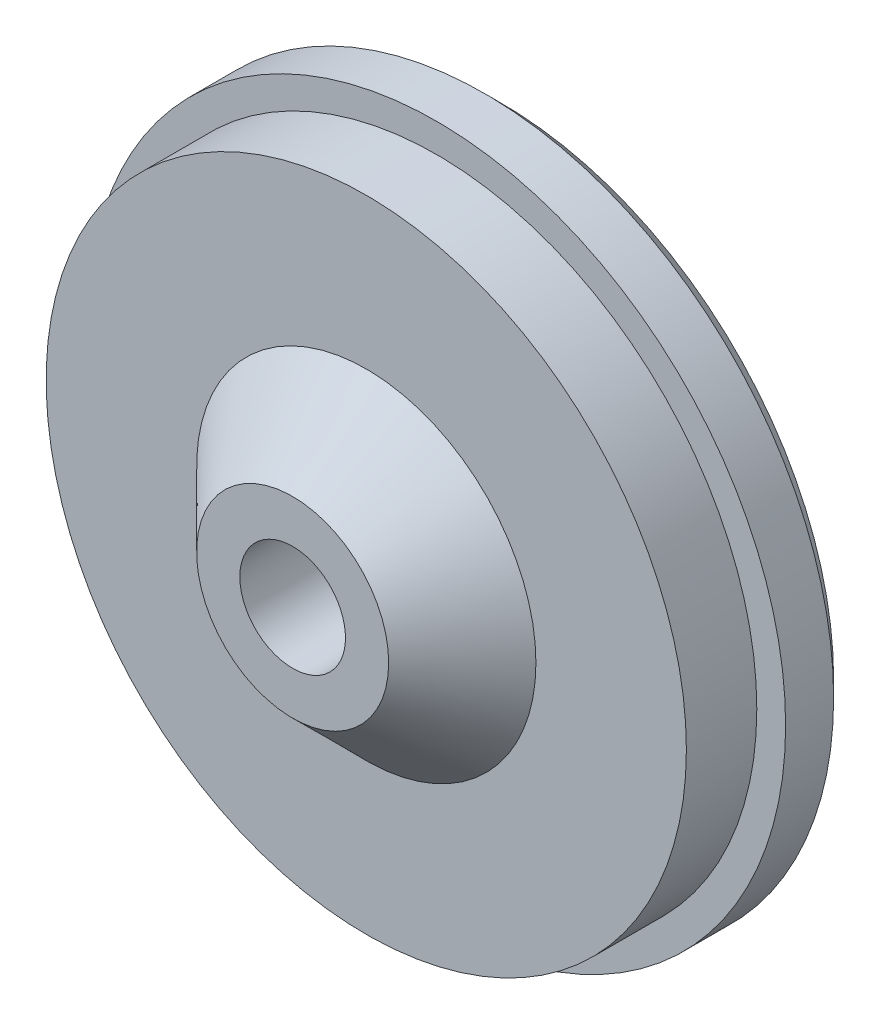
ISO-10303-21;
HEADER;
FILE_DESCRIPTION(('STEP AP214'),'2;1');
FILE_NAME('part.step','',(''),(''),'','','');
FILE_SCHEMA(('AUTOMOTIVE_DESIGN { 1 0 10303 214 1 1 1 1 }'));
ENDSEC;
DATA;
#1=APPLICATION_CONTEXT('core data for automotive mechanical design processes');
#2=APPLICATION_PROTOCOL_DEFINITION('international standard','automotive_design',2000,#1);
#3=PRODUCT_CONTEXT('',#1,'mechanical');
#4=PRODUCT('Part','Part','',(#3));
#5=PRODUCT_RELATED_PRODUCT_CATEGORY('part','',(#4));
#6=PRODUCT_DEFINITION_FORMATION('','',#4);
#7=PRODUCT_DEFINITION_CONTEXT('part definition',#1,'design');
#8=PRODUCT_DEFINITION('design','',#6,#7);
#9=PRODUCT_DEFINITION_SHAPE('','',#8);
#10=(LENGTH_UNIT() NAMED_UNIT(*) SI_UNIT(.MILLI.,.METRE.));
#11=(NAMED_UNIT(*) PLANE_ANGLE_UNIT() SI_UNIT($,.RADIAN.));
#12=(NAMED_UNIT(*) SI_UNIT($,.STERADIAN.) SOLID_ANGLE_UNIT());
#13=UNCERTAINTY_MEASURE_WITH_UNIT(LENGTH_MEASURE(1.E-05),#10,'distance_accuracy_value','');
#14=(GEOMETRIC_REPRESENTATION_CONTEXT(3) GLOBAL_UNCERTAINTY_ASSIGNED_CONTEXT((#13)) GLOBAL_UNIT_ASSIGNED_CONTEXT((#10,
#11,#12)) REPRESENTATION_CONTEXT('',''));
#15=CARTESIAN_POINT('',(0.,0.,0.));
#16=DIRECTION('',(0.,0.,1.));
#17=DIRECTION('',(1.,0.,0.));
#18=AXIS2_PLACEMENT_3D('',#15,#16,#17);
#19=CARTESIAN_POINT('',(0.,0.,4.2));
#20=DIRECTION('',(0.,0.,1.));
#21=DIRECTION('',(1.,0.,0.));
#22=AXIS2_PLACEMENT_3D('',#19,#20,#21);
#23=PLANE('',#22);
#24=CARTESIAN_POINT('',(0.,0.,4.2));
#25=DIRECTION('',(0.,0.,1.));
#26=DIRECTION('',(1.,0.,0.));
#27=AXIS2_PLACEMENT_3D('',#24,#25,#26);
#28=CIRCLE('',#27,5.29999999999999);
#29=CARTESIAN_POINT('',(5.29999999999999,0.,4.2));
#30=VERTEX_POINT('',#29);
#31=EDGE_CURVE('E52',#30,#30,#28,.F.);
#32=ORIENTED_EDGE('',*,*,#31,.T.);
#33=EDGE_LOOP('',(#32));
#34=FACE_BOUND('',#33,.T.);
#35=CARTESIAN_POINT('',(0.,0.,4.2));
#36=DIRECTION('',(0.,0.,1.));
#37=DIRECTION('',(1.,0.,0.));
#38=AXIS2_PLACEMENT_3D('',#35,#36,#37);
#39=CIRCLE('',#38,10.);
#40=CARTESIAN_POINT('',(10.,0.,4.2));
#41=VERTEX_POINT('',#40);
#42=EDGE_CURVE('E58',#41,#41,#39,.T.);
#43=ORIENTED_EDGE('',*,*,#42,.T.);
#44=EDGE_LOOP('',(#43));
#45=FACE_BOUND('',#44,.T.);
#46=ADVANCED_FACE('F32',(#34,#45),#23,.T.);
#47=CARTESIAN_POINT('',(0.,0.,2.));
#48=DIRECTION('',(0.,0.,1.));
#49=DIRECTION('',(1.,0.,0.));
#50=AXIS2_PLACEMENT_3D('',#47,#48,#49);
#51=PLANE('',#50);
#52=CARTESIAN_POINT('',(0.,0.,2.));
#53=DIRECTION('',(0.,0.,1.));
#54=DIRECTION('',(1.,0.,0.));
#55=AXIS2_PLACEMENT_3D('',#52,#53,#54);
#56=CIRCLE('',#55,10.9);
#57=CARTESIAN_POINT('',(10.9,0.,2.));
#58=VERTEX_POINT('',#57);
#59=EDGE_CURVE('E55',#58,#58,#56,.T.);
#60=ORIENTED_EDGE('',*,*,#59,.T.);
#61=EDGE_LOOP('',(#60));
#62=FACE_BOUND('',#61,.T.);
#63=CARTESIAN_POINT('',(0.,0.,2.));
#64=DIRECTION('',(0.,0.,1.));
#65=DIRECTION('',(1.,0.,0.));
#66=AXIS2_PLACEMENT_3D('',#63,#64,#65);
#67=CIRCLE('',#66,10.);
#68=CARTESIAN_POINT('',(10.,0.,2.));
#69=VERTEX_POINT('',#68);
#70=EDGE_CURVE('E59',#69,#69,#67,.T.);
#71=ORIENTED_EDGE('',*,*,#70,.F.);
#72=EDGE_LOOP('',(#71));
#73=FACE_BOUND('',#72,.T.);
#74=ADVANCED_FACE('F89',(#62,#73),#51,.T.);
#75=CARTESIAN_POINT('',(0.,0.,2.));
#76=DIRECTION('',(0.,0.,-1.));
#77=DIRECTION('',(-1.,0.,0.));
#78=AXIS2_PLACEMENT_3D('',#75,#76,#77);
#79=CYLINDRICAL_SURFACE('',#78,10.9);
#80=CARTESIAN_POINT('',(0.,0.,0.499999999999995));
#81=DIRECTION('',(0.,0.,1.));
#82=DIRECTION('',(1.,0.,0.));
#83=AXIS2_PLACEMENT_3D('',#80,#81,#82);
#84=CIRCLE('',#83,10.9);
#85=CARTESIAN_POINT('',(10.9,0.,0.499999999999995));
#86=VERTEX_POINT('',#85);
#87=EDGE_CURVE('E39',#86,#86,#84,.T.);
#88=ORIENTED_EDGE('',*,*,#87,.T.);
#89=EDGE_LOOP('',(#88));
#90=FACE_BOUND('',#89,.T.);
#91=ORIENTED_EDGE('',*,*,#59,.F.);
#92=EDGE_LOOP('',(#91));
#93=FACE_BOUND('',#92,.T.);
#94=ADVANCED_FACE('F95',(#90,#93),#79,.T.);
#95=CARTESIAN_POINT('',(0.,0.,0.));
#96=DIRECTION('',(0.,0.,1.));
#97=DIRECTION('',(1.,0.,0.));
#98=AXIS2_PLACEMENT_3D('',#95,#96,#97);
#99=PLANE('',#98);
#100=CARTESIAN_POINT('',(0.,0.,0.));
#101=DIRECTION('',(0.,0.,1.));
#102=DIRECTION('',(1.,0.,0.));
#103=AXIS2_PLACEMENT_3D('',#100,#101,#102);
#104=CIRCLE('',#103,10.4);
#105=CARTESIAN_POINT('',(10.4,0.,0.));
#106=VERTEX_POINT('',#105);
#107=EDGE_CURVE('E10',#106,#106,#104,.F.);
#108=ORIENTED_EDGE('',*,*,#107,.T.);
#109=EDGE_LOOP('',(#108));
#110=FACE_BOUND('',#109,.T.);
#111=CARTESIAN_POINT('',(0.,0.,0.));
#112=DIRECTION('',(0.,0.,1.));
#113=DIRECTION('',(1.,0.,0.));
#114=AXIS2_PLACEMENT_3D('',#111,#112,#113);
#115=CIRCLE('',#114,2.15);
#116=CARTESIAN_POINT('',(2.15,0.,0.));
#117=VERTEX_POINT('',#116);
#118=EDGE_CURVE('E43',#117,#117,#115,.T.);
#119=ORIENTED_EDGE('',*,*,#118,.T.);
#120=EDGE_LOOP('',(#119));
#121=FACE_BOUND('',#120,.T.);
#122=ADVANCED_FACE('F101',(#110,#121),#99,.F.);
#123=CARTESIAN_POINT('',(0.,0.,4.2));
#124=DIRECTION('',(0.,0.,-1.));
#125=DIRECTION('',(-1.,0.,0.));
#126=AXIS2_PLACEMENT_3D('',#123,#124,#125);
#127=CYLINDRICAL_SURFACE('',#126,10.);
#128=ORIENTED_EDGE('',*,*,#42,.F.);
#129=EDGE_LOOP('',(#128));
#130=FACE_BOUND('',#129,.T.);
#131=ORIENTED_EDGE('',*,*,#70,.T.);
#132=EDGE_LOOP('',(#131));
#133=FACE_BOUND('',#132,.T.);
#134=ADVANCED_FACE('F86',(#130,#133),#127,.T.);
#135=CARTESIAN_POINT('',(0.,0.,6.5));
#136=DIRECTION('',(0.,0.,1.));
#137=DIRECTION('',(1.,0.,0.));
#138=AXIS2_PLACEMENT_3D('',#135,#136,#137);
#139=PLANE('',#138);
#140=CARTESIAN_POINT('',(0.,0.,6.5));
#141=DIRECTION('',(0.,0.,-1.));
#142=DIRECTION('',(-1.,0.,0.));
#143=AXIS2_PLACEMENT_3D('',#140,#141,#142);
#144=CIRCLE('',#143,1.65);
#145=CARTESIAN_POINT('',(-1.65,0.,6.5));
#146=VERTEX_POINT('',#145);
#147=EDGE_CURVE('E67',#146,#146,#144,.T.);
#148=ORIENTED_EDGE('',*,*,#147,.T.);
#149=EDGE_LOOP('',(#148));
#150=FACE_BOUND('',#149,.T.);
#151=CARTESIAN_POINT('',(0.,0.,6.5));
#152=DIRECTION('',(0.,0.,1.));
#153=DIRECTION('',(1.,0.,0.));
#154=AXIS2_PLACEMENT_3D('',#151,#152,#153);
#155=CIRCLE('',#154,3.);
#156=CARTESIAN_POINT('',(3.,0.,6.5));
#157=VERTEX_POINT('',#156);
#158=EDGE_CURVE('E62',#157,#157,#155,.T.);
#159=ORIENTED_EDGE('',*,*,#158,.T.);
#160=EDGE_LOOP('',(#159));
#161=FACE_BOUND('',#160,.T.);
#162=ADVANCED_FACE('F71',(#150,#161),#139,.T.);
#163=CARTESIAN_POINT('',(0.,0.,6.5));
#164=DIRECTION('',(0.,0.,-1.));
#165=DIRECTION('',(-1.,0.,0.));
#166=AXIS2_PLACEMENT_3D('',#163,#164,#165);
#167=CYLINDRICAL_SURFACE('',#166,1.65);
#168=CARTESIAN_POINT('',(0.,0.,0.500000000000001));
#169=DIRECTION('',(0.,0.,1.));
#170=DIRECTION('',(1.,0.,0.));
#171=AXIS2_PLACEMENT_3D('',#168,#169,#170);
#172=CIRCLE('',#171,1.65);
#173=CARTESIAN_POINT('',(1.65,0.,0.500000000000001));
#174=VERTEX_POINT('',#173);
#175=EDGE_CURVE('E47',#174,#174,#172,.F.);
#176=ORIENTED_EDGE('',*,*,#175,.T.);
#177=EDGE_LOOP('',(#176));
#178=FACE_BOUND('',#177,.T.);
#179=ORIENTED_EDGE('',*,*,#147,.F.);
#180=EDGE_LOOP('',(#179));
#181=FACE_BOUND('',#180,.T.);
#182=ADVANCED_FACE('F74',(#178,#181),#167,.F.);
#183=CARTESIAN_POINT('',(0.,0.,6.50000000000001));
#184=DIRECTION('',(0.,0.,-1.));
#185=DIRECTION('',(-1.,0.,0.));
#186=AXIS2_PLACEMENT_3D('',#183,#184,#185);
#187=CONICAL_SURFACE('',#186,3.,0.785398163397443);
#188=ORIENTED_EDGE('',*,*,#31,.F.);
#189=EDGE_LOOP('',(#188));
#190=FACE_BOUND('',#189,.T.);
#191=ORIENTED_EDGE('',*,*,#158,.F.);
#192=EDGE_LOOP('',(#191));
#193=FACE_BOUND('',#192,.T.);
#194=ADVANCED_FACE('F76',(#190,#193),#187,.T.);
#195=CARTESIAN_POINT('',(0.,0.,0.500000000000001));
#196=DIRECTION('',(0.,0.,-1.));
#197=DIRECTION('',(-1.,0.,0.));
#198=AXIS2_PLACEMENT_3D('',#195,#196,#197);
#199=CONICAL_SURFACE('',#198,1.65,0.785398163397449);
#200=ORIENTED_EDGE('',*,*,#118,.F.);
#201=EDGE_LOOP('',(#200));
#202=FACE_BOUND('',#201,.T.);
#203=ORIENTED_EDGE('',*,*,#175,.F.);
#204=EDGE_LOOP('',(#203));
#205=FACE_BOUND('',#204,.T.);
#206=ADVANCED_FACE('F83',(#202,#205),#199,.F.);
#207=CARTESIAN_POINT('',(0.,0.,0.499999999999995));
#208=DIRECTION('',(0.,0.,1.));
#209=DIRECTION('',(1.,0.,0.));
#210=AXIS2_PLACEMENT_3D('',#207,#208,#209);
#211=CONICAL_SURFACE('',#210,10.9,0.785398163397452);
#212=ORIENTED_EDGE('',*,*,#107,.F.);
#213=EDGE_LOOP('',(#212));
#214=FACE_BOUND('',#213,.T.);
#215=ORIENTED_EDGE('',*,*,#87,.F.);
#216=EDGE_LOOP('',(#215));
#217=FACE_BOUND('',#216,.T.);
#218=ADVANCED_FACE('F34',(#214,#217),#211,.T.);
#219=CLOSED_SHELL('',(#46,#74,#94,#122,#134,#162,#182,#194,#206,#218));
#220=MANIFOLD_SOLID_BREP('B2',#219);
#221=ADVANCED_BREP_SHAPE_REPRESENTATION('',(#18,#220),#14);
#222=SHAPE_DEFINITION_REPRESENTATION(#9,#221);
ENDSEC;
END-ISO-10303-21;
